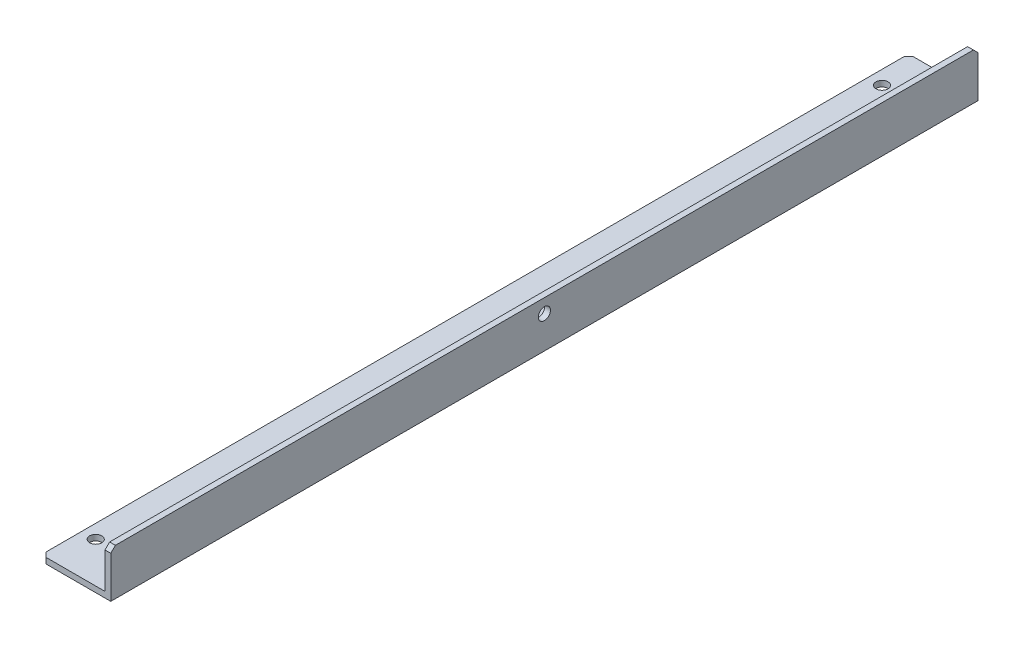
ISO-10303-21;
HEADER;
FILE_DESCRIPTION(('STEP AP214'),'2;1');
FILE_NAME('part.step','',(''),(''),'','','');
FILE_SCHEMA(('AUTOMOTIVE_DESIGN { 1 0 10303 214 1 1 1 1 }'));
ENDSEC;
DATA;
#1=APPLICATION_CONTEXT('core data for automotive mechanical design processes');
#2=APPLICATION_PROTOCOL_DEFINITION('international standard','automotive_design',2000,#1);
#3=PRODUCT_CONTEXT('',#1,'mechanical');
#4=PRODUCT('Part','Part','',(#3));
#5=PRODUCT_RELATED_PRODUCT_CATEGORY('part','',(#4));
#6=PRODUCT_DEFINITION_FORMATION('','',#4);
#7=PRODUCT_DEFINITION_CONTEXT('part definition',#1,'design');
#8=PRODUCT_DEFINITION('design','',#6,#7);
#9=PRODUCT_DEFINITION_SHAPE('','',#8);
#10=(LENGTH_UNIT() NAMED_UNIT(*) SI_UNIT(.MILLI.,.METRE.));
#11=(NAMED_UNIT(*) PLANE_ANGLE_UNIT() SI_UNIT($,.RADIAN.));
#12=(NAMED_UNIT(*) SI_UNIT($,.STERADIAN.) SOLID_ANGLE_UNIT());
#13=UNCERTAINTY_MEASURE_WITH_UNIT(LENGTH_MEASURE(1.E-05),#10,'distance_accuracy_value','');
#14=(GEOMETRIC_REPRESENTATION_CONTEXT(3) GLOBAL_UNCERTAINTY_ASSIGNED_CONTEXT((#13)) GLOBAL_UNIT_ASSIGNED_CONTEXT((#10,
#11,#12)) REPRESENTATION_CONTEXT('',''));
#15=CARTESIAN_POINT('',(0.,0.,0.));
#16=DIRECTION('',(0.,0.,1.));
#17=DIRECTION('',(1.,0.,0.));
#18=AXIS2_PLACEMENT_3D('',#15,#16,#17);
#19=CARTESIAN_POINT('',(0.,40.,750.));
#20=DIRECTION('',(-1.,0.,0.));
#21=DIRECTION('',(0.,-1.,0.));
#22=AXIS2_PLACEMENT_3D('',#19,#20,#21);
#23=PLANE('',#22);
#24=CARTESIAN_POINT('',(0.,27.9999999999999,375.));
#25=DIRECTION('',(-1.,0.,0.));
#26=DIRECTION('',(0.,-1.,0.));
#27=AXIS2_PLACEMENT_3D('',#24,#25,#26);
#28=CIRCLE('',#27,5.25);
#29=CARTESIAN_POINT('',(0.,22.7499999999999,375.));
#30=VERTEX_POINT('',#29);
#31=EDGE_CURVE('E210',#30,#30,#28,.F.);
#32=ORIENTED_EDGE('',*,*,#31,.F.);
#33=EDGE_LOOP('',(#32));
#34=FACE_BOUND('',#33,.T.);
#35=DIRECTION('',(0.,1.,0.));
#36=VECTOR('',#35,1.);
#37=CARTESIAN_POINT('',(0.,40.,0.));
#38=LINE('',#37,#36);
#39=CARTESIAN_POINT('',(0.,0.,0.));
#40=VERTEX_POINT('',#39);
#41=CARTESIAN_POINT('',(0.,36.,0.));
#42=VERTEX_POINT('',#41);
#43=EDGE_CURVE('E144',#40,#42,#38,.T.);
#44=ORIENTED_EDGE('',*,*,#43,.T.);
#45=DIRECTION('',(0.,0.707106781186538,0.707106781186557));
#46=VECTOR('',#45,1.);
#47=CARTESIAN_POINT('',(0.,40.,4.00000000000011));
#48=LINE('',#47,#46);
#49=CARTESIAN_POINT('',(0.,40.,4.00000000000011));
#50=VERTEX_POINT('',#49);
#51=EDGE_CURVE('E189',#42,#50,#48,.T.);
#52=ORIENTED_EDGE('',*,*,#51,.T.);
#53=DIRECTION('',(0.,0.,-1.));
#54=VECTOR('',#53,1.);
#55=CARTESIAN_POINT('',(0.,40.,750.));
#56=LINE('',#55,#54);
#57=CARTESIAN_POINT('',(0.,40.,746.));
#58=VERTEX_POINT('',#57);
#59=EDGE_CURVE('E161',#58,#50,#56,.T.);
#60=ORIENTED_EDGE('',*,*,#59,.F.);
#61=DIRECTION('',(0.,0.707106781186557,-0.707106781186538));
#62=VECTOR('',#61,1.);
#63=CARTESIAN_POINT('',(0.,35.9999999999999,750.));
#64=LINE('',#63,#62);
#65=CARTESIAN_POINT('',(0.,35.9999999999999,750.));
#66=VERTEX_POINT('',#65);
#67=EDGE_CURVE('E48',#58,#66,#64,.F.);
#68=ORIENTED_EDGE('',*,*,#67,.T.);
#69=DIRECTION('',(0.,1.,0.));
#70=VECTOR('',#69,1.);
#71=CARTESIAN_POINT('',(0.,40.,750.));
#72=LINE('',#71,#70);
#73=CARTESIAN_POINT('',(0.,0.,750.));
#74=VERTEX_POINT('',#73);
#75=EDGE_CURVE('E120',#74,#66,#72,.T.);
#76=ORIENTED_EDGE('',*,*,#75,.F.);
#77=DIRECTION('',(0.,0.,-1.));
#78=VECTOR('',#77,1.);
#79=CARTESIAN_POINT('',(0.,0.,750.));
#80=LINE('',#79,#78);
#81=EDGE_CURVE('E140',#74,#40,#80,.T.);
#82=ORIENTED_EDGE('',*,*,#81,.T.);
#83=EDGE_LOOP('',(#44,#52,#60,#68,#76,#82));
#84=FACE_BOUND('',#83,.T.);
#85=ADVANCED_FACE('F33',(#34,#84),#23,.F.);
#86=CARTESIAN_POINT('',(-5.,40.,750.));
#87=DIRECTION('',(0.,-1.,0.));
#88=DIRECTION('',(0.,0.,-1.));
#89=AXIS2_PLACEMENT_3D('',#86,#87,#88);
#90=PLANE('',#89);
#91=ORIENTED_EDGE('',*,*,#59,.T.);
#92=DIRECTION('',(-1.,0.,0.));
#93=VECTOR('',#92,1.);
#94=CARTESIAN_POINT('',(-5.,40.,4.00000000000011));
#95=LINE('',#94,#93);
#96=CARTESIAN_POINT('',(-5.,40.,4.00000000000011));
#97=VERTEX_POINT('',#96);
#98=EDGE_CURVE('E182',#50,#97,#95,.T.);
#99=ORIENTED_EDGE('',*,*,#98,.T.);
#100=DIRECTION('',(0.,0.,-1.));
#101=VECTOR('',#100,1.);
#102=CARTESIAN_POINT('',(-5.,40.,750.));
#103=LINE('',#102,#101);
#104=CARTESIAN_POINT('',(-5.,40.,746.));
#105=VERTEX_POINT('',#104);
#106=EDGE_CURVE('E131',#105,#97,#103,.T.);
#107=ORIENTED_EDGE('',*,*,#106,.F.);
#108=DIRECTION('',(1.,0.,0.));
#109=VECTOR('',#108,1.);
#110=CARTESIAN_POINT('',(-5.,40.,746.));
#111=LINE('',#110,#109);
#112=EDGE_CURVE('E180',#105,#58,#111,.T.);
#113=ORIENTED_EDGE('',*,*,#112,.T.);
#114=EDGE_LOOP('',(#91,#99,#107,#113));
#115=FACE_BOUND('',#114,.T.);
#116=ADVANCED_FACE('F221',(#115),#90,.F.);
#117=CARTESIAN_POINT('',(-5.,4.99999999999999,750.));
#118=DIRECTION('',(1.,0.,0.));
#119=DIRECTION('',(0.,1.,0.));
#120=AXIS2_PLACEMENT_3D('',#117,#118,#119);
#121=PLANE('',#120);
#122=CARTESIAN_POINT('',(-5.,27.9999999999999,375.));
#123=DIRECTION('',(-1.,0.,0.));
#124=DIRECTION('',(0.,-1.,0.));
#125=AXIS2_PLACEMENT_3D('',#122,#123,#124);
#126=CIRCLE('',#125,5.25);
#127=CARTESIAN_POINT('',(-5.,22.7499999999999,375.));
#128=VERTEX_POINT('',#127);
#129=EDGE_CURVE('E213',#128,#128,#126,.T.);
#130=ORIENTED_EDGE('',*,*,#129,.F.);
#131=EDGE_LOOP('',(#130));
#132=FACE_BOUND('',#131,.T.);
#133=ORIENTED_EDGE('',*,*,#106,.T.);
#134=DIRECTION('',(0.,-0.707106781186538,-0.707106781186557));
#135=VECTOR('',#134,1.);
#136=CARTESIAN_POINT('',(-5.,40.,4.00000000000011));
#137=LINE('',#136,#135);
#138=CARTESIAN_POINT('',(-5.,36.,0.));
#139=VERTEX_POINT('',#138);
#140=EDGE_CURVE('E186',#97,#139,#137,.T.);
#141=ORIENTED_EDGE('',*,*,#140,.T.);
#142=DIRECTION('',(0.,-1.,0.));
#143=VECTOR('',#142,1.);
#144=CARTESIAN_POINT('',(-5.,4.99999999999999,0.));
#145=LINE('',#144,#143);
#146=CARTESIAN_POINT('',(-5.,4.99999999999999,0.));
#147=VERTEX_POINT('',#146);
#148=EDGE_CURVE('E127',#139,#147,#145,.T.);
#149=ORIENTED_EDGE('',*,*,#148,.T.);
#150=DIRECTION('',(0.,0.,-1.));
#151=VECTOR('',#150,1.);
#152=CARTESIAN_POINT('',(-5.,4.99999999999999,750.));
#153=LINE('',#152,#151);
#154=CARTESIAN_POINT('',(-5.,4.99999999999999,750.));
#155=VERTEX_POINT('',#154);
#156=EDGE_CURVE('E123',#155,#147,#153,.T.);
#157=ORIENTED_EDGE('',*,*,#156,.F.);
#158=DIRECTION('',(0.,-1.,0.));
#159=VECTOR('',#158,1.);
#160=CARTESIAN_POINT('',(-5.,4.99999999999999,750.));
#161=LINE('',#160,#159);
#162=CARTESIAN_POINT('',(-5.,35.9999999999999,750.));
#163=VERTEX_POINT('',#162);
#164=EDGE_CURVE('E112',#163,#155,#161,.T.);
#165=ORIENTED_EDGE('',*,*,#164,.F.);
#166=DIRECTION('',(0.,-0.707106781186557,0.707106781186538));
#167=VECTOR('',#166,1.);
#168=CARTESIAN_POINT('',(-5.,35.9999999999999,750.));
#169=LINE('',#168,#167);
#170=EDGE_CURVE('E56',#163,#105,#169,.F.);
#171=ORIENTED_EDGE('',*,*,#170,.T.);
#172=EDGE_LOOP('',(#133,#141,#149,#157,#165,#171));
#173=FACE_BOUND('',#172,.T.);
#174=ADVANCED_FACE('F125',(#132,#173),#121,.F.);
#175=CARTESIAN_POINT('',(-60.,4.99999999999999,750.));
#176=DIRECTION('',(0.,-1.,0.));
#177=DIRECTION('',(0.,0.,-1.));
#178=AXIS2_PLACEMENT_3D('',#175,#176,#177);
#179=PLANE('',#178);
#180=CARTESIAN_POINT('',(-48.,4.99999999999999,715.));
#181=DIRECTION('',(0.,1.,0.));
#182=DIRECTION('',(0.,0.,-1.));
#183=AXIS2_PLACEMENT_3D('',#180,#181,#182);
#184=CIRCLE('',#183,5.24999999999999);
#185=CARTESIAN_POINT('',(-48.,4.99999999999999,709.75));
#186=VERTEX_POINT('',#185);
#187=EDGE_CURVE('E207',#186,#186,#184,.T.);
#188=ORIENTED_EDGE('',*,*,#187,.F.);
#189=EDGE_LOOP('',(#188));
#190=FACE_BOUND('',#189,.T.);
#191=CARTESIAN_POINT('',(-48.,4.99999999999999,35.));
#192=DIRECTION('',(0.,1.,0.));
#193=DIRECTION('',(0.,0.,1.));
#194=AXIS2_PLACEMENT_3D('',#191,#192,#193);
#195=CIRCLE('',#194,5.25);
#196=CARTESIAN_POINT('',(-48.,4.99999999999999,40.25));
#197=VERTEX_POINT('',#196);
#198=EDGE_CURVE('E201',#197,#197,#195,.T.);
#199=ORIENTED_EDGE('',*,*,#198,.F.);
#200=EDGE_LOOP('',(#199));
#201=FACE_BOUND('',#200,.T.);
#202=DIRECTION('',(-1.,0.,0.));
#203=VECTOR('',#202,1.);
#204=CARTESIAN_POINT('',(-60.,4.99999999999999,0.));
#205=LINE('',#204,#203);
#206=CARTESIAN_POINT('',(-56.,4.99999999999999,0.));
#207=VERTEX_POINT('',#206);
#208=EDGE_CURVE('E149',#147,#207,#205,.T.);
#209=ORIENTED_EDGE('',*,*,#208,.T.);
#210=DIRECTION('',(-0.707106781186538,0.,0.707106781186557));
#211=VECTOR('',#210,1.);
#212=CARTESIAN_POINT('',(-60.,4.99999999999999,4.00000000000011));
#213=LINE('',#212,#211);
#214=CARTESIAN_POINT('',(-60.,4.99999999999999,4.00000000000011));
#215=VERTEX_POINT('',#214);
#216=EDGE_CURVE('E178',#207,#215,#213,.T.);
#217=ORIENTED_EDGE('',*,*,#216,.T.);
#218=DIRECTION('',(0.,0.,-1.));
#219=VECTOR('',#218,1.);
#220=CARTESIAN_POINT('',(-60.,4.99999999999999,750.));
#221=LINE('',#220,#219);
#222=CARTESIAN_POINT('',(-60.,4.99999999999999,746.));
#223=VERTEX_POINT('',#222);
#224=EDGE_CURVE('E132',#223,#215,#221,.T.);
#225=ORIENTED_EDGE('',*,*,#224,.F.);
#226=DIRECTION('',(-0.707106781186557,0.,-0.707106781186538));
#227=VECTOR('',#226,1.);
#228=CARTESIAN_POINT('',(-55.9999999999998,4.99999999999999,750.));
#229=LINE('',#228,#227);
#230=CARTESIAN_POINT('',(-55.9999999999998,4.99999999999999,750.));
#231=VERTEX_POINT('',#230);
#232=EDGE_CURVE('E137',#223,#231,#229,.F.);
#233=ORIENTED_EDGE('',*,*,#232,.T.);
#234=DIRECTION('',(-1.,0.,0.));
#235=VECTOR('',#234,1.);
#236=CARTESIAN_POINT('',(-60.,4.99999999999999,750.));
#237=LINE('',#236,#235);
#238=EDGE_CURVE('E117',#155,#231,#237,.T.);
#239=ORIENTED_EDGE('',*,*,#238,.F.);
#240=ORIENTED_EDGE('',*,*,#156,.T.);
#241=EDGE_LOOP('',(#209,#217,#225,#233,#239,#240));
#242=FACE_BOUND('',#241,.T.);
#243=ADVANCED_FACE('F134',(#190,#201,#242),#179,.F.);
#244=CARTESIAN_POINT('',(-60.,0.,750.));
#245=DIRECTION('',(1.,0.,0.));
#246=DIRECTION('',(0.,0.,-1.));
#247=AXIS2_PLACEMENT_3D('',#244,#245,#246);
#248=PLANE('',#247);
#249=ORIENTED_EDGE('',*,*,#224,.T.);
#250=DIRECTION('',(0.,-1.,0.));
#251=VECTOR('',#250,1.);
#252=CARTESIAN_POINT('',(-60.,0.,4.00000000000011));
#253=LINE('',#252,#251);
#254=CARTESIAN_POINT('',(-60.,0.,4.00000000000011));
#255=VERTEX_POINT('',#254);
#256=EDGE_CURVE('E166',#215,#255,#253,.T.);
#257=ORIENTED_EDGE('',*,*,#256,.T.);
#258=DIRECTION('',(0.,0.,-1.));
#259=VECTOR('',#258,1.);
#260=CARTESIAN_POINT('',(-60.,0.,750.));
#261=LINE('',#260,#259);
#262=CARTESIAN_POINT('',(-60.,0.,746.));
#263=VERTEX_POINT('',#262);
#264=EDGE_CURVE('E155',#263,#255,#261,.T.);
#265=ORIENTED_EDGE('',*,*,#264,.F.);
#266=DIRECTION('',(0.,1.,0.));
#267=VECTOR('',#266,1.);
#268=CARTESIAN_POINT('',(-60.,0.,746.));
#269=LINE('',#268,#267);
#270=EDGE_CURVE('E164',#263,#223,#269,.T.);
#271=ORIENTED_EDGE('',*,*,#270,.T.);
#272=EDGE_LOOP('',(#249,#257,#265,#271));
#273=FACE_BOUND('',#272,.T.);
#274=ADVANCED_FACE('F227',(#273),#248,.F.);
#275=CARTESIAN_POINT('',(0.,0.,750.));
#276=DIRECTION('',(0.,1.,0.));
#277=DIRECTION('',(-1.,0.,0.));
#278=AXIS2_PLACEMENT_3D('',#275,#276,#277);
#279=PLANE('',#278);
#280=CARTESIAN_POINT('',(-48.,0.,715.));
#281=DIRECTION('',(0.,1.,0.));
#282=DIRECTION('',(-1.,0.,0.));
#283=AXIS2_PLACEMENT_3D('',#280,#281,#282);
#284=CIRCLE('',#283,5.24999999999999);
#285=CARTESIAN_POINT('',(-53.25,0.,715.));
#286=VERTEX_POINT('',#285);
#287=EDGE_CURVE('E204',#286,#286,#284,.F.);
#288=ORIENTED_EDGE('',*,*,#287,.F.);
#289=EDGE_LOOP('',(#288));
#290=FACE_BOUND('',#289,.T.);
#291=CARTESIAN_POINT('',(-48.,0.,35.));
#292=DIRECTION('',(0.,1.,0.));
#293=DIRECTION('',(-1.,0.,0.));
#294=AXIS2_PLACEMENT_3D('',#291,#292,#293);
#295=CIRCLE('',#294,5.25);
#296=CARTESIAN_POINT('',(-53.25,0.,35.));
#297=VERTEX_POINT('',#296);
#298=EDGE_CURVE('E147',#297,#297,#295,.F.);
#299=ORIENTED_EDGE('',*,*,#298,.F.);
#300=EDGE_LOOP('',(#299));
#301=FACE_BOUND('',#300,.T.);
#302=ORIENTED_EDGE('',*,*,#264,.T.);
#303=DIRECTION('',(0.707106781186538,0.,-0.707106781186557));
#304=VECTOR('',#303,1.);
#305=CARTESIAN_POINT('',(-60.,0.,4.00000000000011));
#306=LINE('',#305,#304);
#307=CARTESIAN_POINT('',(-56.,0.,0.));
#308=VERTEX_POINT('',#307);
#309=EDGE_CURVE('E171',#255,#308,#306,.T.);
#310=ORIENTED_EDGE('',*,*,#309,.T.);
#311=DIRECTION('',(1.,0.,0.));
#312=VECTOR('',#311,1.);
#313=CARTESIAN_POINT('',(0.,0.,0.));
#314=LINE('',#313,#312);
#315=EDGE_CURVE('E151',#308,#40,#314,.T.);
#316=ORIENTED_EDGE('',*,*,#315,.T.);
#317=ORIENTED_EDGE('',*,*,#81,.F.);
#318=DIRECTION('',(1.,0.,0.));
#319=VECTOR('',#318,1.);
#320=CARTESIAN_POINT('',(0.,0.,750.));
#321=LINE('',#320,#319);
#322=CARTESIAN_POINT('',(-55.9999999999998,0.,750.));
#323=VERTEX_POINT('',#322);
#324=EDGE_CURVE('E138',#323,#74,#321,.T.);
#325=ORIENTED_EDGE('',*,*,#324,.F.);
#326=DIRECTION('',(0.707106781186557,0.,0.707106781186538));
#327=VECTOR('',#326,1.);
#328=CARTESIAN_POINT('',(-55.9999999999998,0.,750.));
#329=LINE('',#328,#327);
#330=EDGE_CURVE('E169',#323,#263,#329,.F.);
#331=ORIENTED_EDGE('',*,*,#330,.T.);
#332=EDGE_LOOP('',(#302,#310,#316,#317,#325,#331));
#333=FACE_BOUND('',#332,.T.);
#334=ADVANCED_FACE('F194',(#290,#301,#333),#279,.F.);
#335=CARTESIAN_POINT('',(0.,0.,750.));
#336=DIRECTION('',(0.,0.,-1.));
#337=DIRECTION('',(-1.,0.,0.));
#338=AXIS2_PLACEMENT_3D('',#335,#336,#337);
#339=PLANE('',#338);
#340=ORIENTED_EDGE('',*,*,#75,.T.);
#341=DIRECTION('',(-1.,0.,0.));
#342=VECTOR('',#341,1.);
#343=CARTESIAN_POINT('',(0.,35.9999999999999,750.));
#344=LINE('',#343,#342);
#345=EDGE_CURVE('E11',#66,#163,#344,.T.);
#346=ORIENTED_EDGE('',*,*,#345,.T.);
#347=ORIENTED_EDGE('',*,*,#164,.T.);
#348=ORIENTED_EDGE('',*,*,#238,.T.);
#349=DIRECTION('',(0.,-1.,0.));
#350=VECTOR('',#349,1.);
#351=CARTESIAN_POINT('',(-55.9999999999998,0.,750.));
#352=LINE('',#351,#350);
#353=EDGE_CURVE('E41',#231,#323,#352,.T.);
#354=ORIENTED_EDGE('',*,*,#353,.T.);
#355=ORIENTED_EDGE('',*,*,#324,.T.);
#356=EDGE_LOOP('',(#340,#346,#347,#348,#354,#355));
#357=FACE_BOUND('',#356,.T.);
#358=ADVANCED_FACE('F114',(#357),#339,.F.);
#359=CARTESIAN_POINT('',(0.,0.,0.));
#360=DIRECTION('',(0.,0.,-1.));
#361=DIRECTION('',(-1.,0.,0.));
#362=AXIS2_PLACEMENT_3D('',#359,#360,#361);
#363=PLANE('',#362);
#364=ORIENTED_EDGE('',*,*,#315,.F.);
#365=DIRECTION('',(0.,1.,0.));
#366=VECTOR('',#365,1.);
#367=CARTESIAN_POINT('',(-56.,4.99999999999999,0.));
#368=LINE('',#367,#366);
#369=EDGE_CURVE('E175',#308,#207,#368,.T.);
#370=ORIENTED_EDGE('',*,*,#369,.T.);
#371=ORIENTED_EDGE('',*,*,#208,.F.);
#372=ORIENTED_EDGE('',*,*,#148,.F.);
#373=DIRECTION('',(1.,0.,0.));
#374=VECTOR('',#373,1.);
#375=CARTESIAN_POINT('',(0.,36.,0.));
#376=LINE('',#375,#374);
#377=EDGE_CURVE('E173',#139,#42,#376,.T.);
#378=ORIENTED_EDGE('',*,*,#377,.T.);
#379=ORIENTED_EDGE('',*,*,#43,.F.);
#380=EDGE_LOOP('',(#364,#370,#371,#372,#378,#379));
#381=FACE_BOUND('',#380,.T.);
#382=ADVANCED_FACE('F256',(#381),#363,.T.);
#383=CARTESIAN_POINT('',(-48.,-0.00100000000000707,35.));
#384=DIRECTION('',(0.,1.,0.));
#385=DIRECTION('',(0.,0.,1.));
#386=AXIS2_PLACEMENT_3D('',#383,#384,#385);
#387=CYLINDRICAL_SURFACE('',#386,5.25);
#388=ORIENTED_EDGE('',*,*,#198,.T.);
#389=EDGE_LOOP('',(#388));
#390=FACE_BOUND('',#389,.T.);
#391=ORIENTED_EDGE('',*,*,#298,.T.);
#392=EDGE_LOOP('',(#391));
#393=FACE_BOUND('',#392,.T.);
#394=ADVANCED_FACE('F272',(#390,#393),#387,.F.);
#395=CARTESIAN_POINT('',(-48.,-0.00100000000000707,715.));
#396=DIRECTION('',(0.,1.,0.));
#397=DIRECTION('',(0.,0.,1.));
#398=AXIS2_PLACEMENT_3D('',#395,#396,#397);
#399=CYLINDRICAL_SURFACE('',#398,5.24999999999999);
#400=ORIENTED_EDGE('',*,*,#187,.T.);
#401=EDGE_LOOP('',(#400));
#402=FACE_BOUND('',#401,.T.);
#403=ORIENTED_EDGE('',*,*,#287,.T.);
#404=EDGE_LOOP('',(#403));
#405=FACE_BOUND('',#404,.T.);
#406=ADVANCED_FACE('F277',(#402,#405),#399,.F.);
#407=CARTESIAN_POINT('',(0.00100000000000187,27.9999999999999,375.));
#408=DIRECTION('',(-1.,0.,0.));
#409=DIRECTION('',(0.,-1.,0.));
#410=AXIS2_PLACEMENT_3D('',#407,#408,#409);
#411=CYLINDRICAL_SURFACE('',#410,5.25);
#412=CARTESIAN_POINT('',(-5.,22.7499999999999,375.));
#413=CARTESIAN_POINT('',(-4.94791666666667,22.7499999999999,375.));
#414=CARTESIAN_POINT('',(-4.89583333333333,22.7499999999999,375.));
#415=CARTESIAN_POINT('',(-4.79166666666667,22.7499999999999,375.));
#416=CARTESIAN_POINT('',(-4.73958333333333,22.7499999999999,375.));
#417=CARTESIAN_POINT('',(-4.63541666666667,22.7499999999999,375.));
#418=CARTESIAN_POINT('',(-4.58333333333333,22.7499999999999,375.));
#419=CARTESIAN_POINT('',(-4.47916666666667,22.7499999999999,375.));
#420=CARTESIAN_POINT('',(-4.42708333333333,22.7499999999999,375.));
#421=CARTESIAN_POINT('',(-4.32291666666667,22.7499999999999,375.));
#422=CARTESIAN_POINT('',(-4.27083333333333,22.7499999999999,375.));
#423=CARTESIAN_POINT('',(-4.16666666666667,22.7499999999999,375.));
#424=CARTESIAN_POINT('',(-4.11458333333333,22.7499999999999,375.));
#425=CARTESIAN_POINT('',(-4.01041666666667,22.7499999999999,375.));
#426=CARTESIAN_POINT('',(-3.95833333333333,22.7499999999999,375.));
#427=CARTESIAN_POINT('',(-3.85416666666667,22.7499999999999,375.));
#428=CARTESIAN_POINT('',(-3.80208333333333,22.7499999999999,375.));
#429=CARTESIAN_POINT('',(-3.69791666666667,22.7499999999999,375.));
#430=CARTESIAN_POINT('',(-3.64583333333333,22.7499999999999,375.));
#431=CARTESIAN_POINT('',(-3.54166666666667,22.7499999999999,375.));
#432=CARTESIAN_POINT('',(-3.48958333333333,22.7499999999999,375.));
#433=CARTESIAN_POINT('',(-3.38541666666667,22.7499999999999,375.));
#434=CARTESIAN_POINT('',(-3.33333333333333,22.7499999999999,375.));
#435=CARTESIAN_POINT('',(-3.22916666666667,22.7499999999999,375.));
#436=CARTESIAN_POINT('',(-3.17708333333333,22.7499999999999,375.));
#437=CARTESIAN_POINT('',(-3.07291666666667,22.7499999999999,375.));
#438=CARTESIAN_POINT('',(-3.02083333333333,22.7499999999999,375.));
#439=CARTESIAN_POINT('',(-2.91666666666667,22.7499999999999,375.));
#440=CARTESIAN_POINT('',(-2.86458333333333,22.7499999999999,375.));
#441=CARTESIAN_POINT('',(-2.76041666666667,22.7499999999999,375.));
#442=CARTESIAN_POINT('',(-2.70833333333333,22.7499999999999,375.));
#443=CARTESIAN_POINT('',(-2.60416666666667,22.7499999999999,375.));
#444=CARTESIAN_POINT('',(-2.55208333333333,22.7499999999999,375.));
#445=CARTESIAN_POINT('',(-2.44791666666667,22.7499999999999,375.));
#446=CARTESIAN_POINT('',(-2.39583333333333,22.7499999999999,375.));
#447=CARTESIAN_POINT('',(-2.29166666666667,22.7499999999999,375.));
#448=CARTESIAN_POINT('',(-2.23958333333333,22.7499999999999,375.));
#449=CARTESIAN_POINT('',(-2.13541666666667,22.7499999999999,375.));
#450=CARTESIAN_POINT('',(-2.08333333333333,22.7499999999999,375.));
#451=CARTESIAN_POINT('',(-1.97916666666667,22.7499999999999,375.));
#452=CARTESIAN_POINT('',(-1.92708333333333,22.7499999999999,375.));
#453=CARTESIAN_POINT('',(-1.82291666666667,22.7499999999999,375.));
#454=CARTESIAN_POINT('',(-1.77083333333333,22.7499999999999,375.));
#455=CARTESIAN_POINT('',(-1.66666666666667,22.7499999999999,375.));
#456=CARTESIAN_POINT('',(-1.61458333333333,22.7499999999999,375.));
#457=CARTESIAN_POINT('',(-1.51041666666667,22.7499999999999,375.));
#458=CARTESIAN_POINT('',(-1.45833333333333,22.7499999999999,375.));
#459=CARTESIAN_POINT('',(-1.35416666666667,22.7499999999999,375.));
#460=CARTESIAN_POINT('',(-1.30208333333333,22.7499999999999,375.));
#461=CARTESIAN_POINT('',(-1.19791666666667,22.7499999999999,375.));
#462=CARTESIAN_POINT('',(-1.14583333333333,22.7499999999999,375.));
#463=CARTESIAN_POINT('',(-1.04166666666667,22.7499999999999,375.));
#464=CARTESIAN_POINT('',(-0.989583333333335,22.7499999999999,375.));
#465=CARTESIAN_POINT('',(-0.885416666666668,22.7499999999999,375.));
#466=CARTESIAN_POINT('',(-0.833333333333335,22.7499999999999,375.));
#467=CARTESIAN_POINT('',(-0.729166666666668,22.7499999999999,375.));
#468=CARTESIAN_POINT('',(-0.677083333333335,22.7499999999999,375.));
#469=CARTESIAN_POINT('',(-0.572916666666668,22.7499999999999,375.));
#470=CARTESIAN_POINT('',(-0.520833333333334,22.7499999999999,375.));
#471=CARTESIAN_POINT('',(-0.416666666666668,22.7499999999999,375.));
#472=CARTESIAN_POINT('',(-0.364583333333335,22.7499999999999,375.));
#473=CARTESIAN_POINT('',(-0.260416666666669,22.7499999999999,375.));
#474=CARTESIAN_POINT('',(-0.208333333333335,22.7499999999999,375.));
#475=CARTESIAN_POINT('',(-0.104166666666668,22.7499999999999,375.));
#476=CARTESIAN_POINT('',(-0.0520833333333351,22.7499999999999,375.));
#477=CARTESIAN_POINT('',(0.,22.7499999999999,375.));
#478=B_SPLINE_CURVE_WITH_KNOTS('',3,(#412,#413,#414,#415,#416,#417,#418,#419,#420,#421,#422,
#423,#424,#425,#426,#427,#428,#429,#430,#431,#432,#433,#434,#435,#436,#437,#438,#439,#440,#441,
#442,#443,#444,#445,#446,#447,#448,#449,#450,#451,#452,#453,#454,#455,#456,#457,#458,#459,#460,
#461,#462,#463,#464,#465,#466,#467,#468,#469,#470,#471,#472,#473,#474,#475,#476,#477),
.UNSPECIFIED.,.F.,.F.,(4,2,2,2,2,2,2,2,2,2,2,2,2,2,2,2,2,2,2,2,2,2,2,2,2,2,2,2,2,2,2,2,4),(0.,
0.15625,0.3125,0.46875,0.625,0.78125,0.9375,1.09375,1.25,1.40625,1.5625,1.71875,1.875,2.03125,
2.1875,2.34375,2.5,2.65625,2.8125,2.96875,3.125,3.28125,3.4375,3.59375,3.75,3.90625,4.0625,
4.21875,4.375,4.53125,4.6875,4.84375,5.),.UNSPECIFIED.);
#479=EDGE_CURVE('BSEAM217',#128,#30,#478,.T.);
#480=ORIENTED_EDGE('',*,*,#129,.T.);
#481=ORIENTED_EDGE('',*,*,#31,.T.);
#482=ORIENTED_EDGE('',*,*,#479,.T.);
#483=ORIENTED_EDGE('',*,*,#479,.F.);
#484=EDGE_LOOP('',(#480,#482,#481,#483));
#485=FACE_BOUND('',#484,.T.);
#486=ADVANCED_FACE('F217',(#485),#411,.F.);
#487=CARTESIAN_POINT('',(-60.,0.,4.00000000000011));
#488=DIRECTION('',(-0.707106781186557,0.,-0.707106781186538));
#489=DIRECTION('',(0.,1.,0.));
#490=AXIS2_PLACEMENT_3D('',#487,#488,#489);
#491=PLANE('',#490);
#492=ORIENTED_EDGE('',*,*,#216,.F.);
#493=ORIENTED_EDGE('',*,*,#369,.F.);
#494=ORIENTED_EDGE('',*,*,#309,.F.);
#495=ORIENTED_EDGE('',*,*,#256,.F.);
#496=EDGE_LOOP('',(#492,#493,#494,#495));
#497=FACE_BOUND('',#496,.T.);
#498=ADVANCED_FACE('F239',(#497),#491,.T.);
#499=CARTESIAN_POINT('',(-5.,40.,4.00000000000011));
#500=DIRECTION('',(0.,0.707106781186557,-0.707106781186538));
#501=DIRECTION('',(1.,0.,0.));
#502=AXIS2_PLACEMENT_3D('',#499,#500,#501);
#503=PLANE('',#502);
#504=ORIENTED_EDGE('',*,*,#51,.F.);
#505=ORIENTED_EDGE('',*,*,#377,.F.);
#506=ORIENTED_EDGE('',*,*,#140,.F.);
#507=ORIENTED_EDGE('',*,*,#98,.F.);
#508=EDGE_LOOP('',(#504,#505,#506,#507));
#509=FACE_BOUND('',#508,.T.);
#510=ADVANCED_FACE('F242',(#509),#503,.T.);
#511=CARTESIAN_POINT('',(0.,35.9999999999999,750.));
#512=DIRECTION('',(0.,-0.707106781186538,-0.707106781186557));
#513=DIRECTION('',(-1.,0.,0.));
#514=AXIS2_PLACEMENT_3D('',#511,#512,#513);
#515=PLANE('',#514);
#516=ORIENTED_EDGE('',*,*,#67,.F.);
#517=ORIENTED_EDGE('',*,*,#112,.F.);
#518=ORIENTED_EDGE('',*,*,#170,.F.);
#519=ORIENTED_EDGE('',*,*,#345,.F.);
#520=EDGE_LOOP('',(#516,#517,#518,#519));
#521=FACE_BOUND('',#520,.T.);
#522=ADVANCED_FACE('F245',(#521),#515,.F.);
#523=CARTESIAN_POINT('',(-55.9999999999998,0.,750.));
#524=DIRECTION('',(0.707106781186538,0.,-0.707106781186557));
#525=DIRECTION('',(0.,-1.,0.));
#526=AXIS2_PLACEMENT_3D('',#523,#524,#525);
#527=PLANE('',#526);
#528=ORIENTED_EDGE('',*,*,#232,.F.);
#529=ORIENTED_EDGE('',*,*,#270,.F.);
#530=ORIENTED_EDGE('',*,*,#330,.F.);
#531=ORIENTED_EDGE('',*,*,#353,.F.);
#532=EDGE_LOOP('',(#528,#529,#530,#531));
#533=FACE_BOUND('',#532,.T.);
#534=ADVANCED_FACE('F35',(#533),#527,.F.);
#535=CLOSED_SHELL('',(#85,#116,#174,#243,#274,#334,#358,#382,#394,#406,#486,#498,#510,#522,#534));
#536=MANIFOLD_SOLID_BREP('B2',#535);
#537=ADVANCED_BREP_SHAPE_REPRESENTATION('',(#18,#536),#14);
#538=SHAPE_DEFINITION_REPRESENTATION(#9,#537);
ENDSEC;
END-ISO-10303-21;
